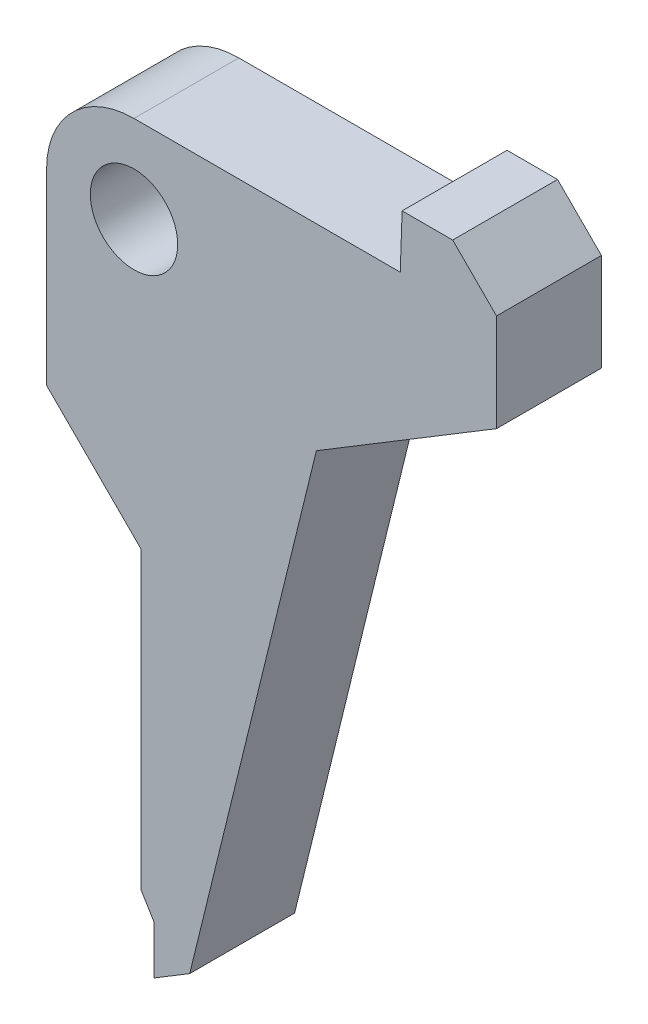
ISO-10303-21;
HEADER;
FILE_DESCRIPTION(('STEP AP214'),'2;1');
FILE_NAME('part.step','',(''),(''),'','','');
FILE_SCHEMA(('AUTOMOTIVE_DESIGN { 1 0 10303 214 1 1 1 1 }'));
ENDSEC;
DATA;
#1=APPLICATION_CONTEXT('core data for automotive mechanical design processes');
#2=APPLICATION_PROTOCOL_DEFINITION('international standard','automotive_design',2000,#1);
#3=PRODUCT_CONTEXT('',#1,'mechanical');
#4=PRODUCT('Part','Part','',(#3));
#5=PRODUCT_RELATED_PRODUCT_CATEGORY('part','',(#4));
#6=PRODUCT_DEFINITION_FORMATION('','',#4);
#7=PRODUCT_DEFINITION_CONTEXT('part definition',#1,'design');
#8=PRODUCT_DEFINITION('design','',#6,#7);
#9=PRODUCT_DEFINITION_SHAPE('','',#8);
#10=(LENGTH_UNIT() NAMED_UNIT(*) SI_UNIT(.MILLI.,.METRE.));
#11=(NAMED_UNIT(*) PLANE_ANGLE_UNIT() SI_UNIT($,.RADIAN.));
#12=(NAMED_UNIT(*) SI_UNIT($,.STERADIAN.) SOLID_ANGLE_UNIT());
#13=UNCERTAINTY_MEASURE_WITH_UNIT(LENGTH_MEASURE(1.E-05),#10,'distance_accuracy_value','');
#14=(GEOMETRIC_REPRESENTATION_CONTEXT(3) GLOBAL_UNCERTAINTY_ASSIGNED_CONTEXT((#13)) GLOBAL_UNIT_ASSIGNED_CONTEXT((#10,
#11,#12)) REPRESENTATION_CONTEXT('',''));
#15=CARTESIAN_POINT('',(0.,0.,0.));
#16=DIRECTION('',(0.,0.,1.));
#17=DIRECTION('',(1.,0.,0.));
#18=AXIS2_PLACEMENT_3D('',#15,#16,#17);
#19=CARTESIAN_POINT('',(0.,5.,6.));
#20=DIRECTION('',(0.,1.,0.));
#21=DIRECTION('',(0.,0.,1.));
#22=AXIS2_PLACEMENT_3D('',#19,#20,#21);
#23=PLANE('',#22);
#24=DIRECTION('',(1.,0.,0.));
#25=VECTOR('',#24,1.);
#26=CARTESIAN_POINT('',(0.,5.,0.));
#27=LINE('',#26,#25);
#28=CARTESIAN_POINT('',(0.,5.,0.));
#29=VERTEX_POINT('',#28);
#30=CARTESIAN_POINT('',(15.2323808823411,5.,0.));
#31=VERTEX_POINT('',#30);
#32=EDGE_CURVE('E169',#29,#31,#27,.T.);
#33=ORIENTED_EDGE('',*,*,#32,.F.);
#34=DIRECTION('',(0.,0.,-1.));
#35=VECTOR('',#34,1.);
#36=CARTESIAN_POINT('',(0.,5.,6.));
#37=LINE('',#36,#35);
#38=CARTESIAN_POINT('',(0.,5.,6.));
#39=VERTEX_POINT('',#38);
#40=EDGE_CURVE('E11',#39,#29,#37,.T.);
#41=ORIENTED_EDGE('',*,*,#40,.F.);
#42=DIRECTION('',(1.,0.,0.));
#43=VECTOR('',#42,1.);
#44=CARTESIAN_POINT('',(0.,5.,6.));
#45=LINE('',#44,#43);
#46=CARTESIAN_POINT('',(15.2323808823411,5.,6.));
#47=VERTEX_POINT('',#46);
#48=EDGE_CURVE('E209',#39,#47,#45,.T.);
#49=ORIENTED_EDGE('',*,*,#48,.T.);
#50=DIRECTION('',(0.,0.,-1.));
#51=VECTOR('',#50,1.);
#52=CARTESIAN_POINT('',(15.2323808823411,5.,6.));
#53=LINE('',#52,#51);
#54=EDGE_CURVE('E51',#47,#31,#53,.T.);
#55=ORIENTED_EDGE('',*,*,#54,.T.);
#56=EDGE_LOOP('',(#33,#41,#49,#55));
#57=FACE_BOUND('',#56,.T.);
#58=ADVANCED_FACE('F35',(#57),#23,.T.);
#59=CARTESIAN_POINT('',(0.,0.,6.));
#60=DIRECTION('',(0.,0.,-1.));
#61=DIRECTION('',(-1.,0.,0.));
#62=AXIS2_PLACEMENT_3D('',#59,#60,#61);
#63=CYLINDRICAL_SURFACE('',#62,5.);
#64=CARTESIAN_POINT('',(0.,0.,0.));
#65=DIRECTION('',(0.,0.,1.));
#66=DIRECTION('',(1.,0.,0.));
#67=AXIS2_PLACEMENT_3D('',#64,#65,#66);
#68=CIRCLE('',#67,5.);
#69=CARTESIAN_POINT('',(-5.,0.,0.));
#70=VERTEX_POINT('',#69);
#71=EDGE_CURVE('E171',#29,#70,#68,.T.);
#72=ORIENTED_EDGE('',*,*,#71,.T.);
#73=DIRECTION('',(0.,0.,-1.));
#74=VECTOR('',#73,1.);
#75=CARTESIAN_POINT('',(-5.,0.,6.));
#76=LINE('',#75,#74);
#77=CARTESIAN_POINT('',(-5.,0.,6.));
#78=VERTEX_POINT('',#77);
#79=EDGE_CURVE('E43',#78,#70,#76,.T.);
#80=ORIENTED_EDGE('',*,*,#79,.F.);
#81=CARTESIAN_POINT('',(0.,0.,6.));
#82=DIRECTION('',(0.,0.,1.));
#83=DIRECTION('',(1.,0.,0.));
#84=AXIS2_PLACEMENT_3D('',#81,#82,#83);
#85=CIRCLE('',#84,5.);
#86=EDGE_CURVE('E254',#39,#78,#85,.T.);
#87=ORIENTED_EDGE('',*,*,#86,.F.);
#88=ORIENTED_EDGE('',*,*,#40,.T.);
#89=EDGE_LOOP('',(#72,#80,#87,#88));
#90=FACE_BOUND('',#89,.T.);
#91=ADVANCED_FACE('F287',(#90),#63,.T.);
#92=CARTESIAN_POINT('',(-5.,0.,6.));
#93=DIRECTION('',(1.,0.,0.));
#94=DIRECTION('',(0.,1.,0.));
#95=AXIS2_PLACEMENT_3D('',#92,#93,#94);
#96=PLANE('',#95);
#97=DIRECTION('',(0.,-1.,0.));
#98=VECTOR('',#97,1.);
#99=CARTESIAN_POINT('',(-5.,0.,0.));
#100=LINE('',#99,#98);
#101=CARTESIAN_POINT('',(-5.,-10.7286289983824,0.));
#102=VERTEX_POINT('',#101);
#103=EDGE_CURVE('E173',#70,#102,#100,.T.);
#104=ORIENTED_EDGE('',*,*,#103,.T.);
#105=DIRECTION('',(0.,0.,-1.));
#106=VECTOR('',#105,1.);
#107=CARTESIAN_POINT('',(-5.,-10.7286289983824,6.));
#108=LINE('',#107,#106);
#109=CARTESIAN_POINT('',(-5.,-10.7286289983824,6.));
#110=VERTEX_POINT('',#109);
#111=EDGE_CURVE('E227',#110,#102,#108,.T.);
#112=ORIENTED_EDGE('',*,*,#111,.F.);
#113=DIRECTION('',(0.,-1.,0.));
#114=VECTOR('',#113,1.);
#115=CARTESIAN_POINT('',(-5.,0.,6.));
#116=LINE('',#115,#114);
#117=EDGE_CURVE('E235',#78,#110,#116,.T.);
#118=ORIENTED_EDGE('',*,*,#117,.F.);
#119=ORIENTED_EDGE('',*,*,#79,.T.);
#120=EDGE_LOOP('',(#104,#112,#118,#119));
#121=FACE_BOUND('',#120,.T.);
#122=ADVANCED_FACE('F233',(#121),#96,.F.);
#123=CARTESIAN_POINT('',(-7.86431449919112,-7.86431449919131,6.));
#124=DIRECTION('',(-0.707106781186539,-0.707106781186556,0.));
#125=DIRECTION('',(0.707106781186556,-0.707106781186539,0.));
#126=AXIS2_PLACEMENT_3D('',#123,#124,#125);
#127=PLANE('',#126);
#128=DIRECTION('',(-0.707106781186556,0.707106781186539,0.));
#129=VECTOR('',#128,1.);
#130=CARTESIAN_POINT('',(-7.86431449919112,-7.86431449919131,0.));
#131=LINE('',#130,#129);
#132=CARTESIAN_POINT('',(0.389281966084427,-16.1179109644666,0.));
#133=VERTEX_POINT('',#132);
#134=EDGE_CURVE('E176',#133,#102,#131,.T.);
#135=ORIENTED_EDGE('',*,*,#134,.F.);
#136=DIRECTION('',(0.,0.,-1.));
#137=VECTOR('',#136,1.);
#138=CARTESIAN_POINT('',(0.389281966084427,-16.1179109644666,6.));
#139=LINE('',#138,#137);
#140=CARTESIAN_POINT('',(0.389281966084427,-16.1179109644666,6.));
#141=VERTEX_POINT('',#140);
#142=EDGE_CURVE('E225',#141,#133,#139,.T.);
#143=ORIENTED_EDGE('',*,*,#142,.F.);
#144=DIRECTION('',(-0.707106781186556,0.707106781186539,0.));
#145=VECTOR('',#144,1.);
#146=CARTESIAN_POINT('',(-7.86431449919112,-7.86431449919131,6.));
#147=LINE('',#146,#145);
#148=EDGE_CURVE('E247',#141,#110,#147,.T.);
#149=ORIENTED_EDGE('',*,*,#148,.T.);
#150=ORIENTED_EDGE('',*,*,#111,.T.);
#151=EDGE_LOOP('',(#135,#143,#149,#150));
#152=FACE_BOUND('',#151,.T.);
#153=ADVANCED_FACE('F244',(#152),#127,.T.);
#154=CARTESIAN_POINT('',(0.389281966084427,0.,6.));
#155=DIRECTION('',(-1.,0.,0.));
#156=DIRECTION('',(0.,0.,1.));
#157=AXIS2_PLACEMENT_3D('',#154,#155,#156);
#158=PLANE('',#157);
#159=DIRECTION('',(0.,1.,0.));
#160=VECTOR('',#159,1.);
#161=CARTESIAN_POINT('',(0.389281966084427,0.,0.));
#162=LINE('',#161,#160);
#163=CARTESIAN_POINT('',(0.389281966084424,-32.9935102757493,0.));
#164=VERTEX_POINT('',#163);
#165=EDGE_CURVE('E179',#164,#133,#162,.T.);
#166=ORIENTED_EDGE('',*,*,#165,.F.);
#167=DIRECTION('',(0.,0.,-1.));
#168=VECTOR('',#167,1.);
#169=CARTESIAN_POINT('',(0.389281966084424,-32.9935102757493,6.));
#170=LINE('',#169,#168);
#171=CARTESIAN_POINT('',(0.389281966084424,-32.9935102757493,6.));
#172=VERTEX_POINT('',#171);
#173=EDGE_CURVE('E223',#172,#164,#170,.T.);
#174=ORIENTED_EDGE('',*,*,#173,.F.);
#175=DIRECTION('',(0.,1.,0.));
#176=VECTOR('',#175,1.);
#177=CARTESIAN_POINT('',(0.389281966084427,0.,6.));
#178=LINE('',#177,#176);
#179=EDGE_CURVE('E250',#172,#141,#178,.T.);
#180=ORIENTED_EDGE('',*,*,#179,.T.);
#181=ORIENTED_EDGE('',*,*,#142,.T.);
#182=EDGE_LOOP('',(#166,#174,#180,#181));
#183=FACE_BOUND('',#182,.T.);
#184=ADVANCED_FACE('F298',(#183),#158,.T.);
#185=CARTESIAN_POINT('',(-14.3380430011799,-8.68766355139631,6.));
#186=DIRECTION('',(-0.855252278491294,-0.518211867999421,0.));
#187=DIRECTION('',(0.518211867999421,-0.855252278491294,0.));
#188=AXIS2_PLACEMENT_3D('',#185,#186,#187);
#189=PLANE('',#188);
#190=DIRECTION('',(-0.518211867999421,0.855252278491294,0.));
#191=VECTOR('',#190,1.);
#192=CARTESIAN_POINT('',(-14.3380430011799,-8.68766355139631,0.));
#193=LINE('',#192,#191);
#194=CARTESIAN_POINT('',(1.14040240651805,-34.2331527999204,0.));
#195=VERTEX_POINT('',#194);
#196=EDGE_CURVE('E182',#195,#164,#193,.T.);
#197=ORIENTED_EDGE('',*,*,#196,.F.);
#198=DIRECTION('',(0.,0.,-1.));
#199=VECTOR('',#198,1.);
#200=CARTESIAN_POINT('',(1.14040240651805,-34.2331527999204,6.));
#201=LINE('',#200,#199);
#202=CARTESIAN_POINT('',(1.14040240651805,-34.2331527999204,6.));
#203=VERTEX_POINT('',#202);
#204=EDGE_CURVE('E221',#203,#195,#201,.T.);
#205=ORIENTED_EDGE('',*,*,#204,.F.);
#206=DIRECTION('',(-0.518211867999421,0.855252278491294,0.));
#207=VECTOR('',#206,1.);
#208=CARTESIAN_POINT('',(-14.3380430011799,-8.68766355139631,6.));
#209=LINE('',#208,#207);
#210=EDGE_CURVE('E252',#203,#172,#209,.T.);
#211=ORIENTED_EDGE('',*,*,#210,.T.);
#212=ORIENTED_EDGE('',*,*,#173,.T.);
#213=EDGE_LOOP('',(#197,#205,#211,#212));
#214=FACE_BOUND('',#213,.T.);
#215=ADVANCED_FACE('F301',(#214),#189,.T.);
#216=CARTESIAN_POINT('',(1.14040240651805,0.,6.));
#217=DIRECTION('',(-1.,0.,0.));
#218=DIRECTION('',(0.,0.,1.));
#219=AXIS2_PLACEMENT_3D('',#216,#217,#218);
#220=PLANE('',#219);
#221=DIRECTION('',(0.,1.,0.));
#222=VECTOR('',#221,1.);
#223=CARTESIAN_POINT('',(1.14040240651805,0.,0.));
#224=LINE('',#223,#222);
#225=CARTESIAN_POINT('',(1.14040240651805,-37.01739139056,0.));
#226=VERTEX_POINT('',#225);
#227=EDGE_CURVE('E185',#226,#195,#224,.T.);
#228=ORIENTED_EDGE('',*,*,#227,.F.);
#229=DIRECTION('',(0.,0.,-1.));
#230=VECTOR('',#229,1.);
#231=CARTESIAN_POINT('',(1.14040240651805,-37.01739139056,6.));
#232=LINE('',#231,#230);
#233=CARTESIAN_POINT('',(1.14040240651805,-37.01739139056,6.));
#234=VERTEX_POINT('',#233);
#235=EDGE_CURVE('E219',#234,#226,#232,.T.);
#236=ORIENTED_EDGE('',*,*,#235,.F.);
#237=DIRECTION('',(0.,1.,0.));
#238=VECTOR('',#237,1.);
#239=CARTESIAN_POINT('',(1.14040240651805,0.,6.));
#240=LINE('',#239,#238);
#241=EDGE_CURVE('E260',#234,#203,#240,.T.);
#242=ORIENTED_EDGE('',*,*,#241,.T.);
#243=ORIENTED_EDGE('',*,*,#204,.T.);
#244=EDGE_LOOP('',(#228,#236,#242,#243));
#245=FACE_BOUND('',#244,.T.);
#246=ADVANCED_FACE('F305',(#245),#220,.T.);
#247=CARTESIAN_POINT('',(16.7124251877983,-27.5820385514516,6.));
#248=DIRECTION('',(0.518211867999421,-0.855252278491295,0.));
#249=DIRECTION('',(0.855252278491295,0.518211867999421,0.));
#250=AXIS2_PLACEMENT_3D('',#247,#248,#249);
#251=PLANE('',#250);
#252=DIRECTION('',(-0.855252278491295,-0.518211867999421,0.));
#253=VECTOR('',#252,1.);
#254=CARTESIAN_POINT('',(16.7124251877983,-27.5820385514516,0.));
#255=LINE('',#254,#253);
#256=CARTESIAN_POINT('',(3.18846975311827,-35.7764326323529,0.));
#257=VERTEX_POINT('',#256);
#258=EDGE_CURVE('E188',#257,#226,#255,.T.);
#259=ORIENTED_EDGE('',*,*,#258,.F.);
#260=DIRECTION('',(0.,0.,-1.));
#261=VECTOR('',#260,1.);
#262=CARTESIAN_POINT('',(3.18846975311827,-35.7764326323529,6.));
#263=LINE('',#262,#261);
#264=CARTESIAN_POINT('',(3.18846975311827,-35.7764326323529,6.));
#265=VERTEX_POINT('',#264);
#266=EDGE_CURVE('E217',#265,#257,#263,.T.);
#267=ORIENTED_EDGE('',*,*,#266,.F.);
#268=DIRECTION('',(-0.855252278491295,-0.518211867999421,0.));
#269=VECTOR('',#268,1.);
#270=CARTESIAN_POINT('',(16.7124251877983,-27.5820385514516,6.));
#271=LINE('',#270,#269);
#272=EDGE_CURVE('E263',#265,#234,#271,.T.);
#273=ORIENTED_EDGE('',*,*,#272,.T.);
#274=ORIENTED_EDGE('',*,*,#235,.T.);
#275=EDGE_LOOP('',(#259,#267,#273,#274));
#276=FACE_BOUND('',#275,.T.);
#277=ADVANCED_FACE('F309',(#276),#251,.T.);
#278=CARTESIAN_POINT('',(11.2880571118338,-2.77002600493703,6.));
#279=DIRECTION('',(0.971185811700182,-0.238323559792686,0.));
#280=DIRECTION('',(0.238323559792686,0.971185811700182,0.));
#281=AXIS2_PLACEMENT_3D('',#278,#279,#280);
#282=PLANE('',#281);
#283=DIRECTION('',(-0.238323559792686,-0.971185811700182,0.));
#284=VECTOR('',#283,1.);
#285=CARTESIAN_POINT('',(11.2880571118338,-2.77002600493703,0.));
#286=LINE('',#285,#284);
#287=CARTESIAN_POINT('',(10.4354775005737,-6.24434982974436,0.));
#288=VERTEX_POINT('',#287);
#289=EDGE_CURVE('E191',#288,#257,#286,.T.);
#290=ORIENTED_EDGE('',*,*,#289,.F.);
#291=DIRECTION('',(0.,0.,-1.));
#292=VECTOR('',#291,1.);
#293=CARTESIAN_POINT('',(10.4354775005737,-6.24434982974436,6.));
#294=LINE('',#293,#292);
#295=CARTESIAN_POINT('',(10.4354775005737,-6.24434982974436,6.));
#296=VERTEX_POINT('',#295);
#297=EDGE_CURVE('E215',#296,#288,#294,.T.);
#298=ORIENTED_EDGE('',*,*,#297,.F.);
#299=DIRECTION('',(-0.238323559792686,-0.971185811700182,0.));
#300=VECTOR('',#299,1.);
#301=CARTESIAN_POINT('',(11.2880571118338,-2.77002600493703,6.));
#302=LINE('',#301,#300);
#303=EDGE_CURVE('E266',#296,#265,#302,.T.);
#304=ORIENTED_EDGE('',*,*,#303,.T.);
#305=ORIENTED_EDGE('',*,*,#266,.T.);
#306=EDGE_LOOP('',(#290,#298,#304,#305));
#307=FACE_BOUND('',#306,.T.);
#308=ADVANCED_FACE('F313',(#307),#282,.T.);
#309=CARTESIAN_POINT('',(5.56988766022183,-9.19249327641912,6.));
#310=DIRECTION('',(0.51821186799942,-0.855252278491295,0.));
#311=DIRECTION('',(0.855252278491295,0.518211867999421,0.));
#312=AXIS2_PLACEMENT_3D('',#309,#310,#311);
#313=PLANE('',#312);
#314=DIRECTION('',(-0.855252278491295,-0.51821186799942,0.));
#315=VECTOR('',#314,1.);
#316=CARTESIAN_POINT('',(5.56988766022183,-9.19249327641912,0.));
#317=LINE('',#316,#315);
#318=CARTESIAN_POINT('',(20.7410971696153,0.,0.));
#319=VERTEX_POINT('',#318);
#320=EDGE_CURVE('E194',#319,#288,#317,.T.);
#321=ORIENTED_EDGE('',*,*,#320,.F.);
#322=DIRECTION('',(0.,0.,-1.));
#323=VECTOR('',#322,1.);
#324=CARTESIAN_POINT('',(20.7410971696153,0.,6.));
#325=LINE('',#324,#323);
#326=CARTESIAN_POINT('',(20.7410971696153,0.,6.));
#327=VERTEX_POINT('',#326);
#328=EDGE_CURVE('E213',#327,#319,#325,.T.);
#329=ORIENTED_EDGE('',*,*,#328,.F.);
#330=DIRECTION('',(-0.855252278491295,-0.51821186799942,0.));
#331=VECTOR('',#330,1.);
#332=CARTESIAN_POINT('',(5.56988766022183,-9.19249327641912,6.));
#333=LINE('',#332,#331);
#334=EDGE_CURVE('E269',#327,#296,#333,.T.);
#335=ORIENTED_EDGE('',*,*,#334,.T.);
#336=ORIENTED_EDGE('',*,*,#297,.T.);
#337=EDGE_LOOP('',(#321,#329,#335,#336));
#338=FACE_BOUND('',#337,.T.);
#339=ADVANCED_FACE('F317',(#338),#313,.T.);
#340=CARTESIAN_POINT('',(20.7410971696153,0.,6.));
#341=DIRECTION('',(1.,0.,0.));
#342=DIRECTION('',(0.,0.,-1.));
#343=AXIS2_PLACEMENT_3D('',#340,#341,#342);
#344=PLANE('',#343);
#345=DIRECTION('',(0.,-1.,0.));
#346=VECTOR('',#345,1.);
#347=CARTESIAN_POINT('',(20.7410971696153,0.,0.));
#348=LINE('',#347,#346);
#349=CARTESIAN_POINT('',(20.7410971696153,5.58326457968618,0.));
#350=VERTEX_POINT('',#349);
#351=EDGE_CURVE('E197',#350,#319,#348,.T.);
#352=ORIENTED_EDGE('',*,*,#351,.F.);
#353=DIRECTION('',(0.,0.,-1.));
#354=VECTOR('',#353,1.);
#355=CARTESIAN_POINT('',(20.7410971696153,5.58326457968618,6.));
#356=LINE('',#355,#354);
#357=CARTESIAN_POINT('',(20.7410971696153,5.58326457968618,6.));
#358=VERTEX_POINT('',#357);
#359=EDGE_CURVE('E146',#358,#350,#356,.T.);
#360=ORIENTED_EDGE('',*,*,#359,.F.);
#361=DIRECTION('',(0.,-1.,0.));
#362=VECTOR('',#361,1.);
#363=CARTESIAN_POINT('',(20.7410971696153,0.,6.));
#364=LINE('',#363,#362);
#365=EDGE_CURVE('E158',#358,#327,#364,.T.);
#366=ORIENTED_EDGE('',*,*,#365,.T.);
#367=ORIENTED_EDGE('',*,*,#328,.T.);
#368=EDGE_LOOP('',(#352,#360,#366,#367));
#369=FACE_BOUND('',#368,.T.);
#370=ADVANCED_FACE('F273',(#369),#344,.T.);
#371=CARTESIAN_POINT('',(13.1621808746505,13.1621808746508,6.));
#372=DIRECTION('',(0.707106781186539,0.707106781186556,0.));
#373=DIRECTION('',(-0.707106781186556,0.707106781186539,0.));
#374=AXIS2_PLACEMENT_3D('',#371,#372,#373);
#375=PLANE('',#374);
#376=DIRECTION('',(0.707106781186556,-0.707106781186539,0.));
#377=VECTOR('',#376,1.);
#378=CARTESIAN_POINT('',(13.1621808746505,13.1621808746508,0.));
#379=LINE('',#378,#377);
#380=CARTESIAN_POINT('',(18.2319848959993,8.09237685330211,0.));
#381=VERTEX_POINT('',#380);
#382=EDGE_CURVE('E142',#381,#350,#379,.T.);
#383=ORIENTED_EDGE('',*,*,#382,.F.);
#384=DIRECTION('',(0.,0.,-1.));
#385=VECTOR('',#384,1.);
#386=CARTESIAN_POINT('',(18.2319848959993,8.09237685330211,6.));
#387=LINE('',#386,#385);
#388=CARTESIAN_POINT('',(18.2319848959993,8.09237685330211,6.));
#389=VERTEX_POINT('',#388);
#390=EDGE_CURVE('E137',#389,#381,#387,.T.);
#391=ORIENTED_EDGE('',*,*,#390,.F.);
#392=DIRECTION('',(0.707106781186556,-0.707106781186539,0.));
#393=VECTOR('',#392,1.);
#394=CARTESIAN_POINT('',(13.1621808746505,13.1621808746508,6.));
#395=LINE('',#394,#393);
#396=EDGE_CURVE('E140',#389,#358,#395,.T.);
#397=ORIENTED_EDGE('',*,*,#396,.T.);
#398=ORIENTED_EDGE('',*,*,#359,.T.);
#399=EDGE_LOOP('',(#383,#391,#397,#398));
#400=FACE_BOUND('',#399,.T.);
#401=ADVANCED_FACE('F139',(#400),#375,.T.);
#402=CARTESIAN_POINT('',(0.,8.09237685330211,6.));
#403=DIRECTION('',(0.,1.,0.));
#404=DIRECTION('',(0.,0.,1.));
#405=AXIS2_PLACEMENT_3D('',#402,#403,#404);
#406=PLANE('',#405);
#407=DIRECTION('',(1.,0.,0.));
#408=VECTOR('',#407,1.);
#409=CARTESIAN_POINT('',(0.,8.09237685330211,0.));
#410=LINE('',#409,#408);
#411=CARTESIAN_POINT('',(15.3403690616169,8.09237685330211,0.));
#412=VERTEX_POINT('',#411);
#413=EDGE_CURVE('E201',#412,#381,#410,.T.);
#414=ORIENTED_EDGE('',*,*,#413,.F.);
#415=DIRECTION('',(0.,0.,-1.));
#416=VECTOR('',#415,1.);
#417=CARTESIAN_POINT('',(15.3403690616169,8.09237685330211,6.));
#418=LINE('',#417,#416);
#419=CARTESIAN_POINT('',(15.3403690616169,8.09237685330211,6.));
#420=VERTEX_POINT('',#419);
#421=EDGE_CURVE('E94',#420,#412,#418,.T.);
#422=ORIENTED_EDGE('',*,*,#421,.F.);
#423=DIRECTION('',(1.,0.,0.));
#424=VECTOR('',#423,1.);
#425=CARTESIAN_POINT('',(0.,8.09237685330211,6.));
#426=LINE('',#425,#424);
#427=EDGE_CURVE('E155',#420,#389,#426,.T.);
#428=ORIENTED_EDGE('',*,*,#427,.T.);
#429=ORIENTED_EDGE('',*,*,#390,.T.);
#430=EDGE_LOOP('',(#414,#422,#428,#429));
#431=FACE_BOUND('',#430,.T.);
#432=ADVANCED_FACE('F160',(#431),#406,.T.);
#433=CARTESIAN_POINT('',(15.0394370408545,-0.525188714189279,6.));
#434=DIRECTION('',(-0.999390827019096,0.0348994967024973,0.));
#435=DIRECTION('',(-0.0348994967024973,-0.999390827019096,0.));
#436=AXIS2_PLACEMENT_3D('',#433,#434,#435);
#437=PLANE('',#436);
#438=DIRECTION('',(0.0348994967024973,0.999390827019096,0.));
#439=VECTOR('',#438,1.);
#440=CARTESIAN_POINT('',(15.0394370408545,-0.525188714189279,0.));
#441=LINE('',#440,#439);
#442=EDGE_CURVE('E203',#31,#412,#441,.T.);
#443=ORIENTED_EDGE('',*,*,#442,.F.);
#444=ORIENTED_EDGE('',*,*,#54,.F.);
#445=DIRECTION('',(0.0348994967024973,0.999390827019096,0.));
#446=VECTOR('',#445,1.);
#447=CARTESIAN_POINT('',(15.0394370408545,-0.525188714189279,6.));
#448=LINE('',#447,#446);
#449=EDGE_CURVE('E161',#47,#420,#448,.T.);
#450=ORIENTED_EDGE('',*,*,#449,.T.);
#451=ORIENTED_EDGE('',*,*,#421,.T.);
#452=EDGE_LOOP('',(#443,#444,#450,#451));
#453=FACE_BOUND('',#452,.T.);
#454=ADVANCED_FACE('F275',(#453),#437,.T.);
#455=CARTESIAN_POINT('',(0.,0.,6.));
#456=DIRECTION('',(0.,0.,-1.));
#457=DIRECTION('',(-1.,0.,0.));
#458=AXIS2_PLACEMENT_3D('',#455,#456,#457);
#459=CYLINDRICAL_SURFACE('',#458,2.5);
#460=CARTESIAN_POINT('',(0.,0.,6.));
#461=DIRECTION('',(0.,0.,1.));
#462=DIRECTION('',(1.,0.,0.));
#463=AXIS2_PLACEMENT_3D('',#460,#461,#462);
#464=CIRCLE('',#463,2.5);
#465=CARTESIAN_POINT('',(2.5,0.,6.));
#466=VERTEX_POINT('',#465);
#467=EDGE_CURVE('E163',#466,#466,#464,.T.);
#468=ORIENTED_EDGE('',*,*,#467,.T.);
#469=EDGE_LOOP('',(#468));
#470=FACE_BOUND('',#469,.T.);
#471=CARTESIAN_POINT('',(0.,0.,0.));
#472=DIRECTION('',(0.,0.,1.));
#473=DIRECTION('',(1.,0.,0.));
#474=AXIS2_PLACEMENT_3D('',#471,#472,#473);
#475=CIRCLE('',#474,2.5);
#476=CARTESIAN_POINT('',(2.5,0.,0.));
#477=VERTEX_POINT('',#476);
#478=EDGE_CURVE('E206',#477,#477,#475,.T.);
#479=ORIENTED_EDGE('',*,*,#478,.F.);
#480=EDGE_LOOP('',(#479));
#481=FACE_BOUND('',#480,.T.);
#482=ADVANCED_FACE('F277',(#470,#481),#459,.F.);
#483=CARTESIAN_POINT('',(0.,0.,6.));
#484=DIRECTION('',(0.,0.,1.));
#485=DIRECTION('',(1.,0.,0.));
#486=AXIS2_PLACEMENT_3D('',#483,#484,#485);
#487=PLANE('',#486);
#488=ORIENTED_EDGE('',*,*,#48,.F.);
#489=ORIENTED_EDGE('',*,*,#86,.T.);
#490=ORIENTED_EDGE('',*,*,#117,.T.);
#491=ORIENTED_EDGE('',*,*,#148,.F.);
#492=ORIENTED_EDGE('',*,*,#179,.F.);
#493=ORIENTED_EDGE('',*,*,#210,.F.);
#494=ORIENTED_EDGE('',*,*,#241,.F.);
#495=ORIENTED_EDGE('',*,*,#272,.F.);
#496=ORIENTED_EDGE('',*,*,#303,.F.);
#497=ORIENTED_EDGE('',*,*,#334,.F.);
#498=ORIENTED_EDGE('',*,*,#365,.F.);
#499=ORIENTED_EDGE('',*,*,#396,.F.);
#500=ORIENTED_EDGE('',*,*,#427,.F.);
#501=ORIENTED_EDGE('',*,*,#449,.F.);
#502=EDGE_LOOP('',(#488,#489,#490,#491,#492,#493,#494,#495,#496,#497,#498,#499,#500,#501));
#503=FACE_BOUND('',#502,.T.);
#504=ORIENTED_EDGE('',*,*,#467,.F.);
#505=EDGE_LOOP('',(#504));
#506=FACE_BOUND('',#505,.T.);
#507=ADVANCED_FACE('F152',(#503,#506),#487,.T.);
#508=CARTESIAN_POINT('',(0.,0.,0.));
#509=DIRECTION('',(0.,0.,1.));
#510=DIRECTION('',(1.,0.,0.));
#511=AXIS2_PLACEMENT_3D('',#508,#509,#510);
#512=PLANE('',#511);
#513=ORIENTED_EDGE('',*,*,#32,.T.);
#514=ORIENTED_EDGE('',*,*,#442,.T.);
#515=ORIENTED_EDGE('',*,*,#413,.T.);
#516=ORIENTED_EDGE('',*,*,#382,.T.);
#517=ORIENTED_EDGE('',*,*,#351,.T.);
#518=ORIENTED_EDGE('',*,*,#320,.T.);
#519=ORIENTED_EDGE('',*,*,#289,.T.);
#520=ORIENTED_EDGE('',*,*,#258,.T.);
#521=ORIENTED_EDGE('',*,*,#227,.T.);
#522=ORIENTED_EDGE('',*,*,#196,.T.);
#523=ORIENTED_EDGE('',*,*,#165,.T.);
#524=ORIENTED_EDGE('',*,*,#134,.T.);
#525=ORIENTED_EDGE('',*,*,#103,.F.);
#526=ORIENTED_EDGE('',*,*,#71,.F.);
#527=EDGE_LOOP('',(#513,#514,#515,#516,#517,#518,#519,#520,#521,#522,#523,#524,#525,#526));
#528=FACE_BOUND('',#527,.T.);
#529=ORIENTED_EDGE('',*,*,#478,.T.);
#530=EDGE_LOOP('',(#529));
#531=FACE_BOUND('',#530,.T.);
#532=ADVANCED_FACE('F239',(#528,#531),#512,.F.);
#533=CLOSED_SHELL('',(#58,#91,#122,#153,#184,#215,#246,#277,#308,#339,#370,#401,#432,#454,#482,
#507,#532));
#534=MANIFOLD_SOLID_BREP('B2',#533);
#535=ADVANCED_BREP_SHAPE_REPRESENTATION('',(#18,#534),#14);
#536=SHAPE_DEFINITION_REPRESENTATION(#9,#535);
ENDSEC;
END-ISO-10303-21;
